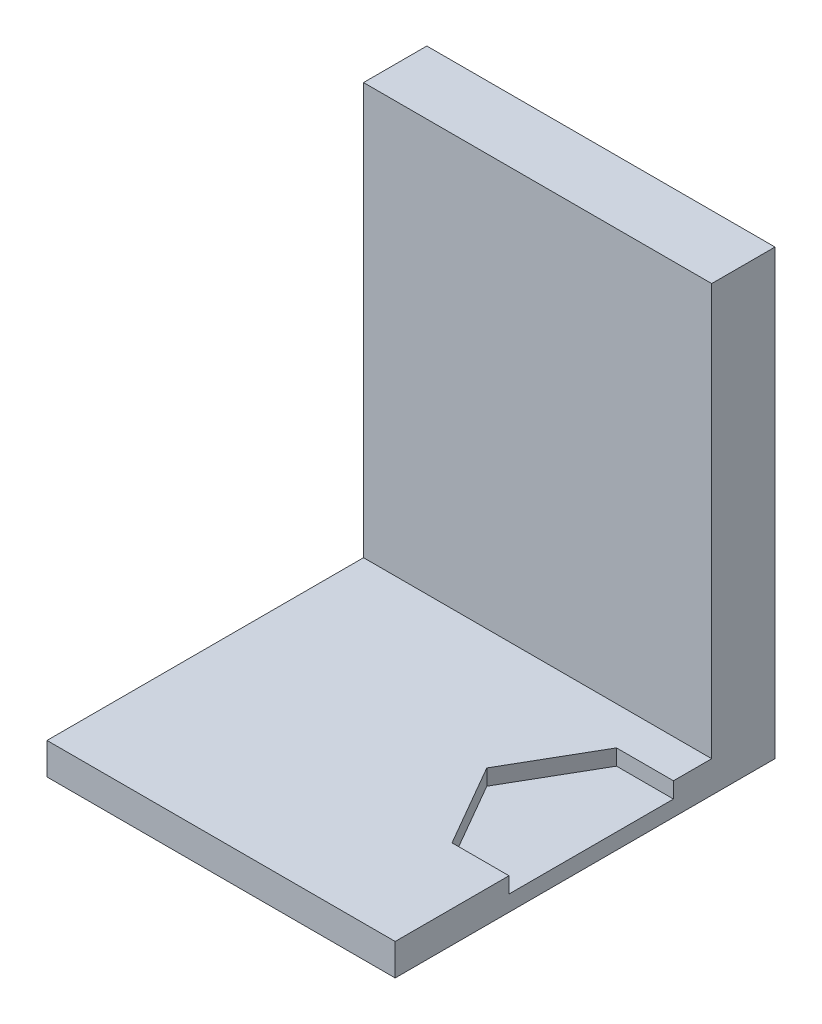
ISO-10303-21;
HEADER;
FILE_DESCRIPTION(('STEP AP214'),'2;1');
FILE_NAME('part.step','',(''),(''),'','','');
FILE_SCHEMA(('AUTOMOTIVE_DESIGN { 1 0 10303 214 1 1 1 1 }'));
ENDSEC;
DATA;
#1=APPLICATION_CONTEXT('core data for automotive mechanical design processes');
#2=APPLICATION_PROTOCOL_DEFINITION('international standard','automotive_design',2000,#1);
#3=PRODUCT_CONTEXT('',#1,'mechanical');
#4=PRODUCT('Part','Part','',(#3));
#5=PRODUCT_RELATED_PRODUCT_CATEGORY('part','',(#4));
#6=PRODUCT_DEFINITION_FORMATION('','',#4);
#7=PRODUCT_DEFINITION_CONTEXT('part definition',#1,'design');
#8=PRODUCT_DEFINITION('design','',#6,#7);
#9=PRODUCT_DEFINITION_SHAPE('','',#8);
#10=(LENGTH_UNIT() NAMED_UNIT(*) SI_UNIT(.MILLI.,.METRE.));
#11=(NAMED_UNIT(*) PLANE_ANGLE_UNIT() SI_UNIT($,.RADIAN.));
#12=(NAMED_UNIT(*) SI_UNIT($,.STERADIAN.) SOLID_ANGLE_UNIT());
#13=UNCERTAINTY_MEASURE_WITH_UNIT(LENGTH_MEASURE(1.E-05),#10,'distance_accuracy_value','');
#14=(GEOMETRIC_REPRESENTATION_CONTEXT(3) GLOBAL_UNCERTAINTY_ASSIGNED_CONTEXT((#13)) GLOBAL_UNIT_ASSIGNED_CONTEXT((#10,
#11,#12)) REPRESENTATION_CONTEXT('',''));
#15=CARTESIAN_POINT('',(0.,0.,0.));
#16=DIRECTION('',(0.,0.,1.));
#17=DIRECTION('',(1.,0.,0.));
#18=AXIS2_PLACEMENT_3D('',#15,#16,#17);
#19=CARTESIAN_POINT('',(0.,530.,0.));
#20=DIRECTION('',(0.,0.,-1.));
#21=DIRECTION('',(-1.,0.,0.));
#22=AXIS2_PLACEMENT_3D('',#19,#20,#21);
#23=PLANE('',#22);
#24=DIRECTION('',(1.,0.,0.));
#25=VECTOR('',#24,1.);
#26=CARTESIAN_POINT('',(9.99999999999982,10.,0.));
#27=LINE('',#26,#25);
#28=CARTESIAN_POINT('',(228.,10.,0.));
#29=VERTEX_POINT('',#28);
#30=CARTESIAN_POINT('',(338.,10.,0.));
#31=VERTEX_POINT('',#30);
#32=EDGE_CURVE('E191',#29,#31,#27,.T.);
#33=ORIENTED_EDGE('',*,*,#32,.F.);
#34=DIRECTION('',(0.,-1.,0.));
#35=VECTOR('',#34,1.);
#36=CARTESIAN_POINT('',(228.,0.,0.));
#37=LINE('',#36,#35);
#38=CARTESIAN_POINT('',(228.,0.,0.));
#39=VERTEX_POINT('',#38);
#40=EDGE_CURVE('E217',#29,#39,#37,.T.);
#41=ORIENTED_EDGE('',*,*,#40,.T.);
#42=DIRECTION('',(1.,0.,0.));
#43=VECTOR('',#42,1.);
#44=CARTESIAN_POINT('',(0.,0.,0.));
#45=LINE('',#44,#43);
#46=CARTESIAN_POINT('',(338.,0.,0.));
#47=VERTEX_POINT('',#46);
#48=EDGE_CURVE('E202',#39,#47,#45,.T.);
#49=ORIENTED_EDGE('',*,*,#48,.T.);
#50=DIRECTION('',(0.,1.,0.));
#51=VECTOR('',#50,1.);
#52=CARTESIAN_POINT('',(338.,0.,0.));
#53=LINE('',#52,#51);
#54=EDGE_CURVE('E226',#47,#31,#53,.T.);
#55=ORIENTED_EDGE('',*,*,#54,.T.);
#56=EDGE_LOOP('',(#33,#41,#49,#55));
#57=FACE_BOUND('',#56,.T.);
#58=ADVANCED_FACE('F38',(#57),#23,.F.);
#59=CARTESIAN_POINT('',(0.,530.,-120.));
#60=DIRECTION('',(0.,0.,1.));
#61=DIRECTION('',(1.,0.,0.));
#62=AXIS2_PLACEMENT_3D('',#59,#60,#61);
#63=PLANE('',#62);
#64=DIRECTION('',(0.,1.,0.));
#65=VECTOR('',#64,1.);
#66=CARTESIAN_POINT('',(228.,530.,-120.));
#67=LINE('',#66,#65);
#68=CARTESIAN_POINT('',(228.,0.,-120.));
#69=VERTEX_POINT('',#68);
#70=CARTESIAN_POINT('',(228.,140.,-120.));
#71=VERTEX_POINT('',#70);
#72=EDGE_CURVE('E133',#69,#71,#67,.T.);
#73=ORIENTED_EDGE('',*,*,#72,.T.);
#74=DIRECTION('',(1.,0.,0.));
#75=VECTOR('',#74,1.);
#76=CARTESIAN_POINT('',(228.,140.,-120.));
#77=LINE('',#76,#75);
#78=CARTESIAN_POINT('',(338.,140.,-120.));
#79=VERTEX_POINT('',#78);
#80=EDGE_CURVE('E53',#71,#79,#77,.T.);
#81=ORIENTED_EDGE('',*,*,#80,.T.);
#82=DIRECTION('',(0.,-1.,0.));
#83=VECTOR('',#82,1.);
#84=CARTESIAN_POINT('',(338.,530.,-120.));
#85=LINE('',#84,#83);
#86=CARTESIAN_POINT('',(338.,0.,-120.));
#87=VERTEX_POINT('',#86);
#88=EDGE_CURVE('E131',#79,#87,#85,.T.);
#89=ORIENTED_EDGE('',*,*,#88,.T.);
#90=DIRECTION('',(-1.,0.,0.));
#91=VECTOR('',#90,1.);
#92=CARTESIAN_POINT('',(0.,0.,-120.));
#93=LINE('',#92,#91);
#94=EDGE_CURVE('E46',#87,#69,#93,.T.);
#95=ORIENTED_EDGE('',*,*,#94,.T.);
#96=EDGE_LOOP('',(#73,#81,#89,#95));
#97=FACE_BOUND('',#96,.T.);
#98=ADVANCED_FACE('F129',(#97),#63,.F.);
#99=CARTESIAN_POINT('',(0.,0.,0.));
#100=DIRECTION('',(0.,-1.,0.));
#101=DIRECTION('',(0.,0.,-1.));
#102=AXIS2_PLACEMENT_3D('',#99,#100,#101);
#103=PLANE('',#102);
#104=DIRECTION('',(0.,0.,-1.));
#105=VECTOR('',#104,1.);
#106=CARTESIAN_POINT('',(228.,0.,0.));
#107=LINE('',#106,#105);
#108=EDGE_CURVE('E213',#39,#69,#107,.T.);
#109=ORIENTED_EDGE('',*,*,#108,.T.);
#110=ORIENTED_EDGE('',*,*,#94,.F.);
#111=DIRECTION('',(0.,0.,-1.));
#112=VECTOR('',#111,1.);
#113=CARTESIAN_POINT('',(338.,0.,0.));
#114=LINE('',#113,#112);
#115=EDGE_CURVE('E138',#47,#87,#114,.T.);
#116=ORIENTED_EDGE('',*,*,#115,.F.);
#117=ORIENTED_EDGE('',*,*,#48,.F.);
#118=EDGE_LOOP('',(#109,#110,#116,#117));
#119=FACE_BOUND('',#118,.T.);
#120=ADVANCED_FACE('F211',(#119),#103,.T.);
#121=CARTESIAN_POINT('',(9.99999999999982,10.,-100.));
#122=DIRECTION('',(0.,-1.,0.));
#123=DIRECTION('',(0.,0.,-1.));
#124=AXIS2_PLACEMENT_3D('',#121,#122,#123);
#125=PLANE('',#124);
#126=DIRECTION('',(1.,0.,0.));
#127=VECTOR('',#126,1.);
#128=CARTESIAN_POINT('',(9.99999999999982,10.,-100.));
#129=LINE('',#128,#127);
#130=CARTESIAN_POINT('',(228.,10.,-100.));
#131=VERTEX_POINT('',#130);
#132=CARTESIAN_POINT('',(338.,10.,-100.));
#133=VERTEX_POINT('',#132);
#134=EDGE_CURVE('E198',#131,#133,#129,.T.);
#135=ORIENTED_EDGE('',*,*,#134,.F.);
#136=DIRECTION('',(0.,0.,1.));
#137=VECTOR('',#136,1.);
#138=CARTESIAN_POINT('',(228.,10.,-100.));
#139=LINE('',#138,#137);
#140=EDGE_CURVE('E146',#131,#29,#139,.T.);
#141=ORIENTED_EDGE('',*,*,#140,.T.);
#142=ORIENTED_EDGE('',*,*,#32,.T.);
#143=DIRECTION('',(0.,0.,-1.));
#144=VECTOR('',#143,1.);
#145=CARTESIAN_POINT('',(338.,10.,-100.));
#146=LINE('',#145,#144);
#147=CARTESIAN_POINT('',(338.,10.,-35.9627984822264));
#148=VERTEX_POINT('',#147);
#149=EDGE_CURVE('E148',#31,#148,#146,.T.);
#150=ORIENTED_EDGE('',*,*,#149,.T.);
#151=DIRECTION('',(1.,0.,0.));
#152=VECTOR('',#151,1.);
#153=CARTESIAN_POINT('',(320.,10.,-35.9627984822264));
#154=LINE('',#153,#152);
#155=CARTESIAN_POINT('',(320.,10.,-35.9627984822264));
#156=VERTEX_POINT('',#155);
#157=EDGE_CURVE('E162',#156,#148,#154,.T.);
#158=ORIENTED_EDGE('',*,*,#157,.F.);
#159=DIRECTION('',(0.5,0.,0.866025403784438));
#160=VECTOR('',#159,1.);
#161=CARTESIAN_POINT('',(305.,10.,-61.9435605957595));
#162=LINE('',#161,#160);
#163=CARTESIAN_POINT('',(305.,10.,-61.9435605957595));
#164=VERTEX_POINT('',#163);
#165=EDGE_CURVE('E181',#164,#156,#162,.T.);
#166=ORIENTED_EDGE('',*,*,#165,.F.);
#167=DIRECTION('',(-0.5,0.,0.866025403784439));
#168=VECTOR('',#167,1.);
#169=CARTESIAN_POINT('',(320.,10.,-87.9243227092926));
#170=LINE('',#169,#168);
#171=CARTESIAN_POINT('',(320.,10.,-87.9243227092926));
#172=VERTEX_POINT('',#171);
#173=EDGE_CURVE('E177',#172,#164,#170,.T.);
#174=ORIENTED_EDGE('',*,*,#173,.F.);
#175=DIRECTION('',(-1.,0.,0.));
#176=VECTOR('',#175,1.);
#177=CARTESIAN_POINT('',(350.,10.,-87.9243227092926));
#178=LINE('',#177,#176);
#179=CARTESIAN_POINT('',(338.,10.,-87.9243227092926));
#180=VERTEX_POINT('',#179);
#181=EDGE_CURVE('E157',#180,#172,#178,.T.);
#182=ORIENTED_EDGE('',*,*,#181,.F.);
#183=EDGE_CURVE('E234',#180,#133,#146,.T.);
#184=ORIENTED_EDGE('',*,*,#183,.T.);
#185=EDGE_LOOP('',(#135,#141,#142,#150,#158,#166,#174,#182,#184));
#186=FACE_BOUND('',#185,.T.);
#187=ADVANCED_FACE('F243',(#186),#125,.F.);
#188=CARTESIAN_POINT('',(0.,0.,-100.));
#189=DIRECTION('',(0.,0.,-1.));
#190=DIRECTION('',(-1.,0.,0.));
#191=AXIS2_PLACEMENT_3D('',#188,#189,#190);
#192=PLANE('',#191);
#193=DIRECTION('',(0.,1.,0.));
#194=VECTOR('',#193,1.);
#195=CARTESIAN_POINT('',(338.,0.,-100.));
#196=LINE('',#195,#194);
#197=CARTESIAN_POINT('',(338.,140.,-100.));
#198=VERTEX_POINT('',#197);
#199=EDGE_CURVE('E142',#133,#198,#196,.T.);
#200=ORIENTED_EDGE('',*,*,#199,.T.);
#201=DIRECTION('',(-1.,0.,0.));
#202=VECTOR('',#201,1.);
#203=CARTESIAN_POINT('',(0.,140.,-100.));
#204=LINE('',#203,#202);
#205=CARTESIAN_POINT('',(228.,140.,-100.));
#206=VERTEX_POINT('',#205);
#207=EDGE_CURVE('E121',#198,#206,#204,.T.);
#208=ORIENTED_EDGE('',*,*,#207,.T.);
#209=DIRECTION('',(0.,-1.,0.));
#210=VECTOR('',#209,1.);
#211=CARTESIAN_POINT('',(228.,0.,-100.));
#212=LINE('',#211,#210);
#213=EDGE_CURVE('E141',#206,#131,#212,.T.);
#214=ORIENTED_EDGE('',*,*,#213,.T.);
#215=ORIENTED_EDGE('',*,*,#134,.T.);
#216=EDGE_LOOP('',(#200,#208,#214,#215));
#217=FACE_BOUND('',#216,.T.);
#218=ADVANCED_FACE('F282',(#217),#192,.F.);
#219=CARTESIAN_POINT('',(320.,5.,-35.9627984822264));
#220=DIRECTION('',(0.,0.,1.));
#221=DIRECTION('',(1.,0.,0.));
#222=AXIS2_PLACEMENT_3D('',#219,#220,#221);
#223=PLANE('',#222);
#224=ORIENTED_EDGE('',*,*,#157,.T.);
#225=DIRECTION('',(0.,-1.,0.));
#226=VECTOR('',#225,1.);
#227=CARTESIAN_POINT('',(338.,5.,-35.9627984822264));
#228=LINE('',#227,#226);
#229=CARTESIAN_POINT('',(338.,5.,-35.9627984822264));
#230=VERTEX_POINT('',#229);
#231=EDGE_CURVE('E221',#148,#230,#228,.T.);
#232=ORIENTED_EDGE('',*,*,#231,.T.);
#233=DIRECTION('',(1.,0.,0.));
#234=VECTOR('',#233,1.);
#235=CARTESIAN_POINT('',(320.,5.,-35.9627984822264));
#236=LINE('',#235,#234);
#237=CARTESIAN_POINT('',(320.,5.,-35.9627984822264));
#238=VERTEX_POINT('',#237);
#239=EDGE_CURVE('E170',#238,#230,#236,.T.);
#240=ORIENTED_EDGE('',*,*,#239,.F.);
#241=DIRECTION('',(0.,1.,0.));
#242=VECTOR('',#241,1.);
#243=CARTESIAN_POINT('',(320.,5.,-35.9627984822264));
#244=LINE('',#243,#242);
#245=EDGE_CURVE('E188',#238,#156,#244,.T.);
#246=ORIENTED_EDGE('',*,*,#245,.T.);
#247=EDGE_LOOP('',(#224,#232,#240,#246));
#248=FACE_BOUND('',#247,.T.);
#249=ADVANCED_FACE('F247',(#248),#223,.F.);
#250=CARTESIAN_POINT('',(305.,5.,-61.9435605957595));
#251=DIRECTION('',(-0.866025403784438,0.,0.5));
#252=DIRECTION('',(0.5,0.,0.866025403784438));
#253=AXIS2_PLACEMENT_3D('',#250,#251,#252);
#254=PLANE('',#253);
#255=ORIENTED_EDGE('',*,*,#165,.T.);
#256=ORIENTED_EDGE('',*,*,#245,.F.);
#257=DIRECTION('',(0.5,0.,0.866025403784438));
#258=VECTOR('',#257,1.);
#259=CARTESIAN_POINT('',(305.,5.,-61.9435605957595));
#260=LINE('',#259,#258);
#261=CARTESIAN_POINT('',(305.,5.,-61.9435605957595));
#262=VERTEX_POINT('',#261);
#263=EDGE_CURVE('E166',#262,#238,#260,.T.);
#264=ORIENTED_EDGE('',*,*,#263,.F.);
#265=DIRECTION('',(0.,1.,0.));
#266=VECTOR('',#265,1.);
#267=CARTESIAN_POINT('',(305.,5.,-61.9435605957595));
#268=LINE('',#267,#266);
#269=EDGE_CURVE('E192',#262,#164,#268,.T.);
#270=ORIENTED_EDGE('',*,*,#269,.T.);
#271=EDGE_LOOP('',(#255,#256,#264,#270));
#272=FACE_BOUND('',#271,.T.);
#273=ADVANCED_FACE('F251',(#272),#254,.F.);
#274=CARTESIAN_POINT('',(320.,5.,-87.9243227092926));
#275=DIRECTION('',(-0.866025403784439,0.,-0.5));
#276=DIRECTION('',(-0.5,0.,0.866025403784439));
#277=AXIS2_PLACEMENT_3D('',#274,#275,#276);
#278=PLANE('',#277);
#279=ORIENTED_EDGE('',*,*,#173,.T.);
#280=ORIENTED_EDGE('',*,*,#269,.F.);
#281=DIRECTION('',(-0.5,0.,0.866025403784439));
#282=VECTOR('',#281,1.);
#283=CARTESIAN_POINT('',(320.,5.,-87.9243227092926));
#284=LINE('',#283,#282);
#285=CARTESIAN_POINT('',(320.,5.,-87.9243227092926));
#286=VERTEX_POINT('',#285);
#287=EDGE_CURVE('E161',#286,#262,#284,.T.);
#288=ORIENTED_EDGE('',*,*,#287,.F.);
#289=DIRECTION('',(0.,1.,0.));
#290=VECTOR('',#289,1.);
#291=CARTESIAN_POINT('',(320.,5.,-87.9243227092926));
#292=LINE('',#291,#290);
#293=EDGE_CURVE('E174',#286,#172,#292,.T.);
#294=ORIENTED_EDGE('',*,*,#293,.T.);
#295=EDGE_LOOP('',(#279,#280,#288,#294));
#296=FACE_BOUND('',#295,.T.);
#297=ADVANCED_FACE('F254',(#296),#278,.F.);
#298=CARTESIAN_POINT('',(350.,5.,-87.9243227092926));
#299=DIRECTION('',(0.,0.,-1.));
#300=DIRECTION('',(-1.,0.,0.));
#301=AXIS2_PLACEMENT_3D('',#298,#299,#300);
#302=PLANE('',#301);
#303=DIRECTION('',(-1.,0.,0.));
#304=VECTOR('',#303,1.);
#305=CARTESIAN_POINT('',(350.,5.,-87.9243227092926));
#306=LINE('',#305,#304);
#307=CARTESIAN_POINT('',(338.,5.,-87.9243227092926));
#308=VERTEX_POINT('',#307);
#309=EDGE_CURVE('E158',#308,#286,#306,.T.);
#310=ORIENTED_EDGE('',*,*,#309,.F.);
#311=DIRECTION('',(0.,1.,0.));
#312=VECTOR('',#311,1.);
#313=CARTESIAN_POINT('',(338.,5.,-87.9243227092926));
#314=LINE('',#313,#312);
#315=EDGE_CURVE('E60',#308,#180,#314,.T.);
#316=ORIENTED_EDGE('',*,*,#315,.T.);
#317=ORIENTED_EDGE('',*,*,#181,.T.);
#318=ORIENTED_EDGE('',*,*,#293,.F.);
#319=EDGE_LOOP('',(#310,#316,#317,#318));
#320=FACE_BOUND('',#319,.T.);
#321=ADVANCED_FACE('F259',(#320),#302,.F.);
#322=CARTESIAN_POINT('',(0.,5.,0.));
#323=DIRECTION('',(0.,1.,0.));
#324=DIRECTION('',(0.,0.,1.));
#325=AXIS2_PLACEMENT_3D('',#322,#323,#324);
#326=PLANE('',#325);
#327=DIRECTION('',(0.,0.,1.));
#328=VECTOR('',#327,1.);
#329=CARTESIAN_POINT('',(338.,5.,0.));
#330=LINE('',#329,#328);
#331=EDGE_CURVE('E11',#308,#230,#330,.T.);
#332=ORIENTED_EDGE('',*,*,#331,.F.);
#333=ORIENTED_EDGE('',*,*,#309,.T.);
#334=ORIENTED_EDGE('',*,*,#287,.T.);
#335=ORIENTED_EDGE('',*,*,#263,.T.);
#336=ORIENTED_EDGE('',*,*,#239,.T.);
#337=EDGE_LOOP('',(#332,#333,#334,#335,#336));
#338=FACE_BOUND('',#337,.T.);
#339=ADVANCED_FACE('F261',(#338),#326,.T.);
#340=CARTESIAN_POINT('',(338.,0.,0.));
#341=DIRECTION('',(-1.,0.,0.));
#342=DIRECTION('',(0.,0.,1.));
#343=AXIS2_PLACEMENT_3D('',#340,#341,#342);
#344=PLANE('',#343);
#345=ORIENTED_EDGE('',*,*,#88,.F.);
#346=DIRECTION('',(0.,0.,1.));
#347=VECTOR('',#346,1.);
#348=CARTESIAN_POINT('',(338.,140.,-120.));
#349=LINE('',#348,#347);
#350=EDGE_CURVE('E118',#79,#198,#349,.T.);
#351=ORIENTED_EDGE('',*,*,#350,.T.);
#352=ORIENTED_EDGE('',*,*,#199,.F.);
#353=ORIENTED_EDGE('',*,*,#183,.F.);
#354=ORIENTED_EDGE('',*,*,#315,.F.);
#355=ORIENTED_EDGE('',*,*,#331,.T.);
#356=ORIENTED_EDGE('',*,*,#231,.F.);
#357=ORIENTED_EDGE('',*,*,#149,.F.);
#358=ORIENTED_EDGE('',*,*,#54,.F.);
#359=ORIENTED_EDGE('',*,*,#115,.T.);
#360=EDGE_LOOP('',(#345,#351,#352,#353,#354,#355,#356,#357,#358,#359));
#361=FACE_BOUND('',#360,.T.);
#362=ADVANCED_FACE('F136',(#361),#344,.F.);
#363=CARTESIAN_POINT('',(228.,0.,0.));
#364=DIRECTION('',(1.,0.,0.));
#365=DIRECTION('',(0.,0.,-1.));
#366=AXIS2_PLACEMENT_3D('',#363,#364,#365);
#367=PLANE('',#366);
#368=ORIENTED_EDGE('',*,*,#213,.F.);
#369=DIRECTION('',(0.,0.,1.));
#370=VECTOR('',#369,1.);
#371=CARTESIAN_POINT('',(228.,140.,-120.));
#372=LINE('',#371,#370);
#373=EDGE_CURVE('E125',#71,#206,#372,.T.);
#374=ORIENTED_EDGE('',*,*,#373,.F.);
#375=ORIENTED_EDGE('',*,*,#72,.F.);
#376=ORIENTED_EDGE('',*,*,#108,.F.);
#377=ORIENTED_EDGE('',*,*,#40,.F.);
#378=ORIENTED_EDGE('',*,*,#140,.F.);
#379=EDGE_LOOP('',(#368,#374,#375,#376,#377,#378));
#380=FACE_BOUND('',#379,.T.);
#381=ADVANCED_FACE('F269',(#380),#367,.F.);
#382=CARTESIAN_POINT('',(228.,140.,-120.));
#383=DIRECTION('',(0.,-1.,0.));
#384=DIRECTION('',(0.,0.,-1.));
#385=AXIS2_PLACEMENT_3D('',#382,#383,#384);
#386=PLANE('',#385);
#387=ORIENTED_EDGE('',*,*,#350,.F.);
#388=ORIENTED_EDGE('',*,*,#80,.F.);
#389=ORIENTED_EDGE('',*,*,#373,.T.);
#390=ORIENTED_EDGE('',*,*,#207,.F.);
#391=EDGE_LOOP('',(#387,#388,#389,#390));
#392=FACE_BOUND('',#391,.T.);
#393=ADVANCED_FACE('F119',(#392),#386,.F.);
#394=CLOSED_SHELL('',(#58,#98,#120,#187,#218,#249,#273,#297,#321,#339,#362,#381,#393));
#395=MANIFOLD_SOLID_BREP('B2',#394);
#396=ADVANCED_BREP_SHAPE_REPRESENTATION('',(#18,#395),#14);
#397=SHAPE_DEFINITION_REPRESENTATION(#9,#396);
ENDSEC;
END-ISO-10303-21;
